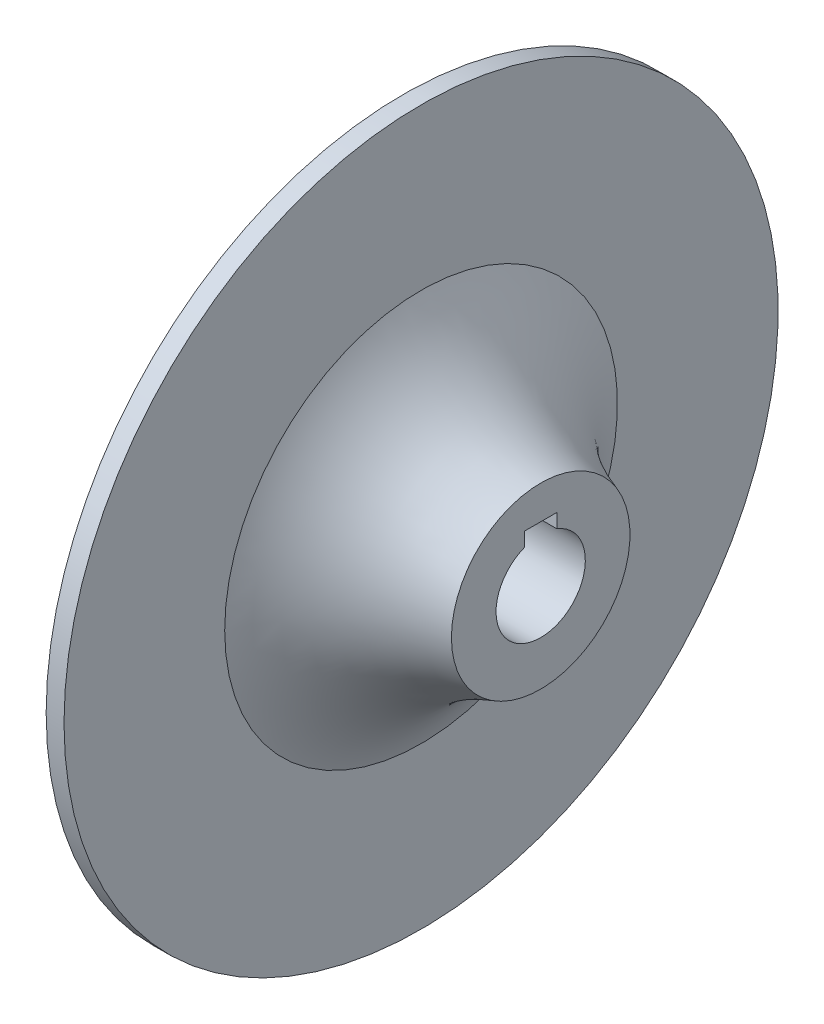
ISO-10303-21;
HEADER;
FILE_DESCRIPTION(('STEP AP214'),'2;1');
FILE_NAME('part.step','',(''),(''),'','','');
FILE_SCHEMA(('AUTOMOTIVE_DESIGN { 1 0 10303 214 1 1 1 1 }'));
ENDSEC;
DATA;
#1=APPLICATION_CONTEXT('core data for automotive mechanical design processes');
#2=APPLICATION_PROTOCOL_DEFINITION('international standard','automotive_design',2000,#1);
#3=PRODUCT_CONTEXT('',#1,'mechanical');
#4=PRODUCT('Part','Part','',(#3));
#5=PRODUCT_RELATED_PRODUCT_CATEGORY('part','',(#4));
#6=PRODUCT_DEFINITION_FORMATION('','',#4);
#7=PRODUCT_DEFINITION_CONTEXT('part definition',#1,'design');
#8=PRODUCT_DEFINITION('design','',#6,#7);
#9=PRODUCT_DEFINITION_SHAPE('','',#8);
#10=(LENGTH_UNIT() NAMED_UNIT(*) SI_UNIT(.MILLI.,.METRE.));
#11=(NAMED_UNIT(*) PLANE_ANGLE_UNIT() SI_UNIT($,.RADIAN.));
#12=(NAMED_UNIT(*) SI_UNIT($,.STERADIAN.) SOLID_ANGLE_UNIT());
#13=UNCERTAINTY_MEASURE_WITH_UNIT(LENGTH_MEASURE(1.E-05),#10,'distance_accuracy_value','');
#14=(GEOMETRIC_REPRESENTATION_CONTEXT(3) GLOBAL_UNCERTAINTY_ASSIGNED_CONTEXT((#13)) GLOBAL_UNIT_ASSIGNED_CONTEXT((#10,
#11,#12)) REPRESENTATION_CONTEXT('',''));
#15=CARTESIAN_POINT('',(0.,0.,0.));
#16=DIRECTION('',(0.,0.,1.));
#17=DIRECTION('',(1.,0.,0.));
#18=AXIS2_PLACEMENT_3D('',#15,#16,#17);
#19=CARTESIAN_POINT('',(19.25,0.,0.));
#20=DIRECTION('',(1.,0.,0.));
#21=DIRECTION('',(0.,0.,-1.));
#22=AXIS2_PLACEMENT_3D('',#19,#20,#21);
#23=PLANE('',#22);
#24=DIRECTION('',(0.,-1.,0.));
#25=VECTOR('',#24,1.);
#26=CARTESIAN_POINT('',(19.25,0.,2.25));
#27=LINE('',#26,#25);
#28=CARTESIAN_POINT('',(19.25,7.8,2.25));
#29=VERTEX_POINT('',#28);
#30=CARTESIAN_POINT('',(19.25,5.8309518948453,2.25));
#31=VERTEX_POINT('',#30);
#32=EDGE_CURVE('E49',#29,#31,#27,.T.);
#33=ORIENTED_EDGE('',*,*,#32,.F.);
#34=DIRECTION('',(0.,0.,-1.));
#35=VECTOR('',#34,1.);
#36=CARTESIAN_POINT('',(19.25,7.8,0.));
#37=LINE('',#36,#35);
#38=CARTESIAN_POINT('',(19.25,7.8,-2.25));
#39=VERTEX_POINT('',#38);
#40=EDGE_CURVE('E118',#29,#39,#37,.T.);
#41=ORIENTED_EDGE('',*,*,#40,.T.);
#42=DIRECTION('',(0.,-1.,0.));
#43=VECTOR('',#42,1.);
#44=CARTESIAN_POINT('',(19.25,0.,-2.25));
#45=LINE('',#44,#43);
#46=CARTESIAN_POINT('',(19.25,5.8309518948453,-2.25));
#47=VERTEX_POINT('',#46);
#48=EDGE_CURVE('E121',#39,#47,#45,.T.);
#49=ORIENTED_EDGE('',*,*,#48,.T.);
#50=CARTESIAN_POINT('',(19.25,0.,0.));
#51=DIRECTION('',(1.,0.,0.));
#52=DIRECTION('',(0.,0.,-1.));
#53=AXIS2_PLACEMENT_3D('',#50,#51,#52);
#54=CIRCLE('',#53,6.25);
#55=EDGE_CURVE('E130',#31,#47,#54,.T.);
#56=ORIENTED_EDGE('',*,*,#55,.F.);
#57=EDGE_LOOP('',(#33,#41,#49,#56));
#58=FACE_BOUND('',#57,.T.);
#59=CARTESIAN_POINT('',(19.25,0.,0.));
#60=DIRECTION('',(-1.,0.,0.));
#61=DIRECTION('',(0.,0.,1.));
#62=AXIS2_PLACEMENT_3D('',#59,#60,#61);
#63=CIRCLE('',#62,12.5);
#64=CARTESIAN_POINT('',(19.25,0.,12.5));
#65=VERTEX_POINT('',#64);
#66=EDGE_CURVE('E11',#65,#65,#63,.T.);
#67=ORIENTED_EDGE('',*,*,#66,.F.);
#68=EDGE_LOOP('',(#67));
#69=FACE_BOUND('',#68,.T.);
#70=ADVANCED_FACE('F35',(#58,#69),#23,.T.);
#71=CARTESIAN_POINT('',(26.9046380199181,0.,0.));
#72=DIRECTION('',(-1.,0.,0.));
#73=DIRECTION('',(0.,0.,1.));
#74=AXIS2_PLACEMENT_3D('',#71,#72,#73);
#75=TOROIDAL_SURFACE('',#74,37.8997624555752,26.528125);
#76=ORIENTED_EDGE('',*,*,#66,.T.);
#77=EDGE_LOOP('',(#76));
#78=FACE_BOUND('',#77,.T.);
#79=CARTESIAN_POINT('',(2.5,0.,0.));
#80=DIRECTION('',(-1.,0.,0.));
#81=DIRECTION('',(0.,0.,1.));
#82=AXIS2_PLACEMENT_3D('',#79,#80,#81);
#83=CIRCLE('',#82,27.5);
#84=CARTESIAN_POINT('',(2.5,0.,27.5));
#85=VERTEX_POINT('',#84);
#86=EDGE_CURVE('E42',#85,#85,#83,.T.);
#87=ORIENTED_EDGE('',*,*,#86,.F.);
#88=EDGE_LOOP('',(#87));
#89=FACE_BOUND('',#88,.T.);
#90=ADVANCED_FACE('F181',(#78,#89),#75,.F.);
#91=CARTESIAN_POINT('',(2.5,0.,0.));
#92=DIRECTION('',(1.,0.,0.));
#93=DIRECTION('',(0.,0.,-1.));
#94=AXIS2_PLACEMENT_3D('',#91,#92,#93);
#95=PLANE('',#94);
#96=ORIENTED_EDGE('',*,*,#86,.T.);
#97=EDGE_LOOP('',(#96));
#98=FACE_BOUND('',#97,.T.);
#99=CARTESIAN_POINT('',(2.5,0.,0.));
#100=DIRECTION('',(-1.,0.,0.));
#101=DIRECTION('',(0.,0.,1.));
#102=AXIS2_PLACEMENT_3D('',#99,#100,#101);
#103=CIRCLE('',#102,50.);
#104=CARTESIAN_POINT('',(2.5,0.,50.));
#105=VERTEX_POINT('',#104);
#106=EDGE_CURVE('E173',#105,#105,#103,.T.);
#107=ORIENTED_EDGE('',*,*,#106,.F.);
#108=EDGE_LOOP('',(#107));
#109=FACE_BOUND('',#108,.T.);
#110=ADVANCED_FACE('F178',(#98,#109),#95,.T.);
#111=CARTESIAN_POINT('',(-75.1176501771289,0.,0.));
#112=DIRECTION('',(-1.,0.,0.));
#113=DIRECTION('',(0.,0.,1.));
#114=AXIS2_PLACEMENT_3D('',#111,#112,#113);
#115=CYLINDRICAL_SURFACE('',#114,50.);
#116=ORIENTED_EDGE('',*,*,#106,.T.);
#117=EDGE_LOOP('',(#116));
#118=FACE_BOUND('',#117,.T.);
#119=CARTESIAN_POINT('',(0.,0.,0.));
#120=DIRECTION('',(-1.,0.,0.));
#121=DIRECTION('',(0.,0.,1.));
#122=AXIS2_PLACEMENT_3D('',#119,#120,#121);
#123=CIRCLE('',#122,50.);
#124=CARTESIAN_POINT('',(0.,0.,50.));
#125=VERTEX_POINT('',#124);
#126=EDGE_CURVE('E170',#125,#125,#123,.T.);
#127=ORIENTED_EDGE('',*,*,#126,.F.);
#128=EDGE_LOOP('',(#127));
#129=FACE_BOUND('',#128,.T.);
#130=ADVANCED_FACE('F188',(#118,#129),#115,.T.);
#131=CARTESIAN_POINT('',(0.,0.,0.));
#132=DIRECTION('',(-1.,0.,0.));
#133=DIRECTION('',(0.,0.,1.));
#134=AXIS2_PLACEMENT_3D('',#131,#132,#133);
#135=PLANE('',#134);
#136=ORIENTED_EDGE('',*,*,#126,.T.);
#137=EDGE_LOOP('',(#136));
#138=FACE_BOUND('',#137,.T.);
#139=DIRECTION('',(0.,1.,0.));
#140=VECTOR('',#139,1.);
#141=CARTESIAN_POINT('',(0.,0.,2.4));
#142=LINE('',#141,#140);
#143=CARTESIAN_POINT('',(0.,6.46915759585435,2.4));
#144=VERTEX_POINT('',#143);
#145=CARTESIAN_POINT('',(0.,8.8,2.4));
#146=VERTEX_POINT('',#145);
#147=EDGE_CURVE('E57',#144,#146,#142,.T.);
#148=ORIENTED_EDGE('',*,*,#147,.F.);
#149=CARTESIAN_POINT('',(0.,0.,0.));
#150=DIRECTION('',(-1.,0.,0.));
#151=DIRECTION('',(0.,0.,1.));
#152=AXIS2_PLACEMENT_3D('',#149,#150,#151);
#153=CIRCLE('',#152,6.9);
#154=CARTESIAN_POINT('',(0.,6.46915759585435,-2.4));
#155=VERTEX_POINT('',#154);
#156=EDGE_CURVE('E137',#155,#144,#153,.T.);
#157=ORIENTED_EDGE('',*,*,#156,.F.);
#158=DIRECTION('',(0.,1.,0.));
#159=VECTOR('',#158,1.);
#160=CARTESIAN_POINT('',(0.,0.,-2.4));
#161=LINE('',#160,#159);
#162=CARTESIAN_POINT('',(0.,8.8,-2.4));
#163=VERTEX_POINT('',#162);
#164=EDGE_CURVE('E145',#155,#163,#161,.T.);
#165=ORIENTED_EDGE('',*,*,#164,.T.);
#166=DIRECTION('',(0.,0.,1.));
#167=VECTOR('',#166,1.);
#168=CARTESIAN_POINT('',(0.,8.8,0.));
#169=LINE('',#168,#167);
#170=EDGE_CURVE('E157',#163,#146,#169,.T.);
#171=ORIENTED_EDGE('',*,*,#170,.T.);
#172=EDGE_LOOP('',(#148,#157,#165,#171));
#173=FACE_BOUND('',#172,.T.);
#174=ADVANCED_FACE('F194',(#138,#173),#135,.T.);
#175=CARTESIAN_POINT('',(-14.,0.,0.));
#176=DIRECTION('',(1.,0.,0.));
#177=DIRECTION('',(0.,0.,-1.));
#178=AXIS2_PLACEMENT_3D('',#175,#176,#177);
#179=CYLINDRICAL_SURFACE('',#178,6.9);
#180=ORIENTED_EDGE('',*,*,#156,.T.);
#181=DIRECTION('',(1.,0.,0.));
#182=VECTOR('',#181,1.);
#183=CARTESIAN_POINT('',(-14.,6.46915759585435,2.4));
#184=LINE('',#183,#182);
#185=CARTESIAN_POINT('',(-14.,6.46915759585435,2.4));
#186=VERTEX_POINT('',#185);
#187=EDGE_CURVE('E168',#186,#144,#184,.T.);
#188=ORIENTED_EDGE('',*,*,#187,.F.);
#189=CARTESIAN_POINT('',(-14.,0.,0.));
#190=DIRECTION('',(-1.,0.,0.));
#191=DIRECTION('',(0.,0.,1.));
#192=AXIS2_PLACEMENT_3D('',#189,#190,#191);
#193=CIRCLE('',#192,6.9);
#194=CARTESIAN_POINT('',(-14.,6.46915759585435,-2.4));
#195=VERTEX_POINT('',#194);
#196=EDGE_CURVE('E141',#195,#186,#193,.T.);
#197=ORIENTED_EDGE('',*,*,#196,.F.);
#198=DIRECTION('',(1.,0.,0.));
#199=VECTOR('',#198,1.);
#200=CARTESIAN_POINT('',(-14.,6.46915759585435,-2.4));
#201=LINE('',#200,#199);
#202=EDGE_CURVE('E153',#195,#155,#201,.T.);
#203=ORIENTED_EDGE('',*,*,#202,.T.);
#204=EDGE_LOOP('',(#180,#188,#197,#203));
#205=FACE_BOUND('',#204,.T.);
#206=ADVANCED_FACE('F198',(#205),#179,.T.);
#207=CARTESIAN_POINT('',(-14.,0.,2.4));
#208=DIRECTION('',(0.,0.,-1.));
#209=DIRECTION('',(0.,1.,0.));
#210=AXIS2_PLACEMENT_3D('',#207,#208,#209);
#211=PLANE('',#210);
#212=ORIENTED_EDGE('',*,*,#147,.T.);
#213=DIRECTION('',(1.,0.,0.));
#214=VECTOR('',#213,1.);
#215=CARTESIAN_POINT('',(-14.,8.8,2.4));
#216=LINE('',#215,#214);
#217=CARTESIAN_POINT('',(-14.,8.8,2.4));
#218=VERTEX_POINT('',#217);
#219=EDGE_CURVE('E165',#218,#146,#216,.T.);
#220=ORIENTED_EDGE('',*,*,#219,.F.);
#221=DIRECTION('',(0.,1.,0.));
#222=VECTOR('',#221,1.);
#223=CARTESIAN_POINT('',(-14.,0.,2.4));
#224=LINE('',#223,#222);
#225=EDGE_CURVE('E144',#186,#218,#224,.T.);
#226=ORIENTED_EDGE('',*,*,#225,.F.);
#227=ORIENTED_EDGE('',*,*,#187,.T.);
#228=EDGE_LOOP('',(#212,#220,#226,#227));
#229=FACE_BOUND('',#228,.T.);
#230=ADVANCED_FACE('F202',(#229),#211,.F.);
#231=CARTESIAN_POINT('',(-14.,8.8,0.));
#232=DIRECTION('',(0.,1.,0.));
#233=DIRECTION('',(0.,0.,1.));
#234=AXIS2_PLACEMENT_3D('',#231,#232,#233);
#235=PLANE('',#234);
#236=ORIENTED_EDGE('',*,*,#170,.F.);
#237=DIRECTION('',(1.,0.,0.));
#238=VECTOR('',#237,1.);
#239=CARTESIAN_POINT('',(-14.,8.8,-2.4));
#240=LINE('',#239,#238);
#241=CARTESIAN_POINT('',(-14.,8.8,-2.4));
#242=VERTEX_POINT('',#241);
#243=EDGE_CURVE('E162',#242,#163,#240,.T.);
#244=ORIENTED_EDGE('',*,*,#243,.F.);
#245=DIRECTION('',(0.,0.,1.));
#246=VECTOR('',#245,1.);
#247=CARTESIAN_POINT('',(-14.,8.8,0.));
#248=LINE('',#247,#246);
#249=EDGE_CURVE('E147',#242,#218,#248,.T.);
#250=ORIENTED_EDGE('',*,*,#249,.T.);
#251=ORIENTED_EDGE('',*,*,#219,.T.);
#252=EDGE_LOOP('',(#236,#244,#250,#251));
#253=FACE_BOUND('',#252,.T.);
#254=ADVANCED_FACE('F206',(#253),#235,.T.);
#255=CARTESIAN_POINT('',(-14.,0.,-2.4));
#256=DIRECTION('',(0.,0.,-1.));
#257=DIRECTION('',(-1.,0.,0.));
#258=AXIS2_PLACEMENT_3D('',#255,#256,#257);
#259=PLANE('',#258);
#260=ORIENTED_EDGE('',*,*,#164,.F.);
#261=ORIENTED_EDGE('',*,*,#202,.F.);
#262=DIRECTION('',(0.,1.,0.));
#263=VECTOR('',#262,1.);
#264=CARTESIAN_POINT('',(-14.,0.,-2.4));
#265=LINE('',#264,#263);
#266=EDGE_CURVE('E150',#195,#242,#265,.T.);
#267=ORIENTED_EDGE('',*,*,#266,.T.);
#268=ORIENTED_EDGE('',*,*,#243,.T.);
#269=EDGE_LOOP('',(#260,#261,#267,#268));
#270=FACE_BOUND('',#269,.T.);
#271=ADVANCED_FACE('F210',(#270),#259,.T.);
#272=CARTESIAN_POINT('',(-14.,0.,0.));
#273=DIRECTION('',(-1.,0.,0.));
#274=DIRECTION('',(0.,0.,1.));
#275=AXIS2_PLACEMENT_3D('',#272,#273,#274);
#276=PLANE('',#275);
#277=CARTESIAN_POINT('',(-14.,0.,0.));
#278=DIRECTION('',(1.,0.,0.));
#279=DIRECTION('',(0.,0.,-1.));
#280=AXIS2_PLACEMENT_3D('',#277,#278,#279);
#281=CIRCLE('',#280,2.25);
#282=CARTESIAN_POINT('',(-14.,0.,-2.25));
#283=VERTEX_POINT('',#282);
#284=EDGE_CURVE('E131',#283,#283,#281,.T.);
#285=ORIENTED_EDGE('',*,*,#284,.T.);
#286=EDGE_LOOP('',(#285));
#287=FACE_BOUND('',#286,.T.);
#288=ORIENTED_EDGE('',*,*,#196,.T.);
#289=ORIENTED_EDGE('',*,*,#225,.T.);
#290=ORIENTED_EDGE('',*,*,#249,.F.);
#291=ORIENTED_EDGE('',*,*,#266,.F.);
#292=EDGE_LOOP('',(#288,#289,#290,#291));
#293=FACE_BOUND('',#292,.T.);
#294=ADVANCED_FACE('F214',(#287,#293),#276,.T.);
#295=CARTESIAN_POINT('',(-4.,0.,2.25));
#296=DIRECTION('',(0.,0.,1.));
#297=DIRECTION('',(0.,-1.,0.));
#298=AXIS2_PLACEMENT_3D('',#295,#296,#297);
#299=PLANE('',#298);
#300=ORIENTED_EDGE('',*,*,#32,.T.);
#301=DIRECTION('',(1.,0.,0.));
#302=VECTOR('',#301,1.);
#303=CARTESIAN_POINT('',(-4.,5.8309518948453,2.25));
#304=LINE('',#303,#302);
#305=CARTESIAN_POINT('',(-4.,5.8309518948453,2.25));
#306=VERTEX_POINT('',#305);
#307=EDGE_CURVE('E97',#306,#31,#304,.T.);
#308=ORIENTED_EDGE('',*,*,#307,.F.);
#309=DIRECTION('',(0.,-1.,0.));
#310=VECTOR('',#309,1.);
#311=CARTESIAN_POINT('',(-4.,0.,2.25));
#312=LINE('',#311,#310);
#313=CARTESIAN_POINT('',(-4.,7.8,2.25));
#314=VERTEX_POINT('',#313);
#315=EDGE_CURVE('E101',#314,#306,#312,.T.);
#316=ORIENTED_EDGE('',*,*,#315,.F.);
#317=DIRECTION('',(1.,0.,0.));
#318=VECTOR('',#317,1.);
#319=CARTESIAN_POINT('',(-4.,7.8,2.25));
#320=LINE('',#319,#318);
#321=EDGE_CURVE('E135',#314,#29,#320,.T.);
#322=ORIENTED_EDGE('',*,*,#321,.T.);
#323=EDGE_LOOP('',(#300,#308,#316,#322));
#324=FACE_BOUND('',#323,.T.);
#325=ADVANCED_FACE('F99',(#324),#299,.F.);
#326=CARTESIAN_POINT('',(-4.,7.8,0.));
#327=DIRECTION('',(0.,-1.,0.));
#328=DIRECTION('',(0.,0.,-1.));
#329=AXIS2_PLACEMENT_3D('',#326,#327,#328);
#330=PLANE('',#329);
#331=ORIENTED_EDGE('',*,*,#40,.F.);
#332=ORIENTED_EDGE('',*,*,#321,.F.);
#333=DIRECTION('',(0.,0.,-1.));
#334=VECTOR('',#333,1.);
#335=CARTESIAN_POINT('',(-4.,7.8,0.));
#336=LINE('',#335,#334);
#337=CARTESIAN_POINT('',(-4.,7.8,-2.25));
#338=VERTEX_POINT('',#337);
#339=EDGE_CURVE('E106',#314,#338,#336,.T.);
#340=ORIENTED_EDGE('',*,*,#339,.T.);
#341=DIRECTION('',(1.,0.,0.));
#342=VECTOR('',#341,1.);
#343=CARTESIAN_POINT('',(-4.,7.8,-2.25));
#344=LINE('',#343,#342);
#345=EDGE_CURVE('E138',#338,#39,#344,.T.);
#346=ORIENTED_EDGE('',*,*,#345,.T.);
#347=EDGE_LOOP('',(#331,#332,#340,#346));
#348=FACE_BOUND('',#347,.T.);
#349=ADVANCED_FACE('F221',(#348),#330,.T.);
#350=CARTESIAN_POINT('',(-4.,0.,-2.25));
#351=DIRECTION('',(0.,0.,1.));
#352=DIRECTION('',(0.,-1.,0.));
#353=AXIS2_PLACEMENT_3D('',#350,#351,#352);
#354=PLANE('',#353);
#355=ORIENTED_EDGE('',*,*,#48,.F.);
#356=ORIENTED_EDGE('',*,*,#345,.F.);
#357=DIRECTION('',(0.,-1.,0.));
#358=VECTOR('',#357,1.);
#359=CARTESIAN_POINT('',(-4.,0.,-2.25));
#360=LINE('',#359,#358);
#361=CARTESIAN_POINT('',(-4.,5.8309518948453,-2.25));
#362=VERTEX_POINT('',#361);
#363=EDGE_CURVE('E114',#338,#362,#360,.T.);
#364=ORIENTED_EDGE('',*,*,#363,.T.);
#365=DIRECTION('',(1.,0.,0.));
#366=VECTOR('',#365,1.);
#367=CARTESIAN_POINT('',(-4.,5.8309518948453,-2.25));
#368=LINE('',#367,#366);
#369=EDGE_CURVE('E105',#362,#47,#368,.T.);
#370=ORIENTED_EDGE('',*,*,#369,.T.);
#371=EDGE_LOOP('',(#355,#356,#364,#370));
#372=FACE_BOUND('',#371,.T.);
#373=ADVANCED_FACE('F224',(#372),#354,.T.);
#374=CARTESIAN_POINT('',(-4.,0.,0.));
#375=DIRECTION('',(1.,0.,0.));
#376=DIRECTION('',(0.,0.,-1.));
#377=AXIS2_PLACEMENT_3D('',#374,#375,#376);
#378=CYLINDRICAL_SURFACE('',#377,6.25);
#379=ORIENTED_EDGE('',*,*,#55,.T.);
#380=ORIENTED_EDGE('',*,*,#369,.F.);
#381=CARTESIAN_POINT('',(-4.,0.,0.));
#382=DIRECTION('',(1.,0.,0.));
#383=DIRECTION('',(0.,0.,-1.));
#384=AXIS2_PLACEMENT_3D('',#381,#382,#383);
#385=CIRCLE('',#384,6.25);
#386=EDGE_CURVE('E110',#306,#362,#385,.T.);
#387=ORIENTED_EDGE('',*,*,#386,.F.);
#388=ORIENTED_EDGE('',*,*,#307,.T.);
#389=EDGE_LOOP('',(#379,#380,#387,#388));
#390=FACE_BOUND('',#389,.T.);
#391=ADVANCED_FACE('F111',(#390),#378,.F.);
#392=CARTESIAN_POINT('',(-4.,0.,0.));
#393=DIRECTION('',(1.,0.,0.));
#394=DIRECTION('',(0.,0.,-1.));
#395=AXIS2_PLACEMENT_3D('',#392,#393,#394);
#396=PLANE('',#395);
#397=CARTESIAN_POINT('',(-4.,0.,0.));
#398=DIRECTION('',(1.,0.,0.));
#399=DIRECTION('',(0.,0.,-1.));
#400=AXIS2_PLACEMENT_3D('',#397,#398,#399);
#401=CIRCLE('',#400,2.25);
#402=CARTESIAN_POINT('',(-4.,0.,-2.25));
#403=VERTEX_POINT('',#402);
#404=EDGE_CURVE('E124',#403,#403,#401,.T.);
#405=ORIENTED_EDGE('',*,*,#404,.F.);
#406=EDGE_LOOP('',(#405));
#407=FACE_BOUND('',#406,.T.);
#408=ORIENTED_EDGE('',*,*,#315,.T.);
#409=ORIENTED_EDGE('',*,*,#386,.T.);
#410=ORIENTED_EDGE('',*,*,#363,.F.);
#411=ORIENTED_EDGE('',*,*,#339,.F.);
#412=EDGE_LOOP('',(#408,#409,#410,#411));
#413=FACE_BOUND('',#412,.T.);
#414=ADVANCED_FACE('F117',(#407,#413),#396,.T.);
#415=CARTESIAN_POINT('',(-14.,0.,0.));
#416=DIRECTION('',(1.,0.,0.));
#417=DIRECTION('',(0.,0.,-1.));
#418=AXIS2_PLACEMENT_3D('',#415,#416,#417);
#419=CYLINDRICAL_SURFACE('',#418,2.25);
#420=ORIENTED_EDGE('',*,*,#284,.F.);
#421=EDGE_LOOP('',(#420));
#422=FACE_BOUND('',#421,.T.);
#423=ORIENTED_EDGE('',*,*,#404,.T.);
#424=EDGE_LOOP('',(#423));
#425=FACE_BOUND('',#424,.T.);
#426=ADVANCED_FACE('F233',(#422,#425),#419,.F.);
#427=CLOSED_SHELL('',(#70,#90,#110,#130,#174,#206,#230,#254,#271,#294,#325,#349,#373,#391,#414,#426));
#428=MANIFOLD_SOLID_BREP('B2',#427);
#429=ADVANCED_BREP_SHAPE_REPRESENTATION('',(#18,#428),#14);
#430=SHAPE_DEFINITION_REPRESENTATION(#9,#429);
ENDSEC;
END-ISO-10303-21;
